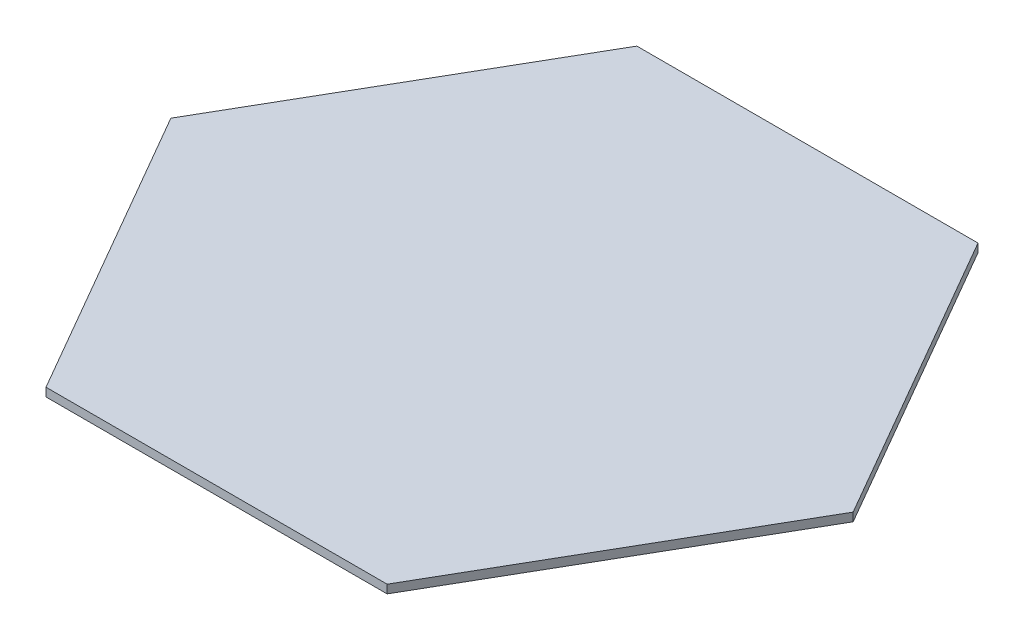
ISO-10303-21;
HEADER;
FILE_DESCRIPTION(('STEP AP214'),'2;1');
FILE_NAME('part.step','',(''),(''),'','','');
FILE_SCHEMA(('AUTOMOTIVE_DESIGN { 1 0 10303 214 1 1 1 1 }'));
ENDSEC;
DATA;
#1=APPLICATION_CONTEXT('core data for automotive mechanical design processes');
#2=APPLICATION_PROTOCOL_DEFINITION('international standard','automotive_design',2000,#1);
#3=PRODUCT_CONTEXT('',#1,'mechanical');
#4=PRODUCT('Part','Part','',(#3));
#5=PRODUCT_RELATED_PRODUCT_CATEGORY('part','',(#4));
#6=PRODUCT_DEFINITION_FORMATION('','',#4);
#7=PRODUCT_DEFINITION_CONTEXT('part definition',#1,'design');
#8=PRODUCT_DEFINITION('design','',#6,#7);
#9=PRODUCT_DEFINITION_SHAPE('','',#8);
#10=(LENGTH_UNIT() NAMED_UNIT(*) SI_UNIT(.MILLI.,.METRE.));
#11=(NAMED_UNIT(*) PLANE_ANGLE_UNIT() SI_UNIT($,.RADIAN.));
#12=(NAMED_UNIT(*) SI_UNIT($,.STERADIAN.) SOLID_ANGLE_UNIT());
#13=UNCERTAINTY_MEASURE_WITH_UNIT(LENGTH_MEASURE(1.E-05),#10,'distance_accuracy_value','');
#14=(GEOMETRIC_REPRESENTATION_CONTEXT(3) GLOBAL_UNCERTAINTY_ASSIGNED_CONTEXT((#13)) GLOBAL_UNIT_ASSIGNED_CONTEXT((#10,
#11,#12)) REPRESENTATION_CONTEXT('',''));
#15=CARTESIAN_POINT('',(0.,0.,0.));
#16=DIRECTION('',(0.,0.,1.));
#17=DIRECTION('',(1.,0.,0.));
#18=AXIS2_PLACEMENT_3D('',#15,#16,#17);
#19=CARTESIAN_POINT('',(80.8290376865489,4.,139.999999999998));
#20=DIRECTION('',(-0.866025403784442,0.,-0.499999999999995));
#21=DIRECTION('',(-0.499999999999995,0.,0.866025403784442));
#22=AXIS2_PLACEMENT_3D('',#19,#20,#21);
#23=PLANE('',#22);
#24=DIRECTION('',(0.499999999999995,0.,-0.866025403784442));
#25=VECTOR('',#24,1.);
#26=CARTESIAN_POINT('',(80.8290376865489,0.,139.999999999998));
#27=LINE('',#26,#25);
#28=CARTESIAN_POINT('',(80.8290376865489,0.,139.999999999998));
#29=VERTEX_POINT('',#28);
#30=CARTESIAN_POINT('',(161.658075373094,0.,0.));
#31=VERTEX_POINT('',#30);
#32=EDGE_CURVE('E132',#29,#31,#27,.T.);
#33=ORIENTED_EDGE('',*,*,#32,.T.);
#34=DIRECTION('',(0.,-1.,0.));
#35=VECTOR('',#34,1.);
#36=CARTESIAN_POINT('',(161.658075373094,4.,0.));
#37=LINE('',#36,#35);
#38=CARTESIAN_POINT('',(161.658075373094,4.,0.));
#39=VERTEX_POINT('',#38);
#40=EDGE_CURVE('E11',#39,#31,#37,.T.);
#41=ORIENTED_EDGE('',*,*,#40,.F.);
#42=DIRECTION('',(0.499999999999995,0.,-0.866025403784442));
#43=VECTOR('',#42,1.);
#44=CARTESIAN_POINT('',(80.8290376865489,4.,139.999999999998));
#45=LINE('',#44,#43);
#46=CARTESIAN_POINT('',(80.8290376865489,4.,139.999999999998));
#47=VERTEX_POINT('',#46);
#48=EDGE_CURVE('E148',#47,#39,#45,.T.);
#49=ORIENTED_EDGE('',*,*,#48,.F.);
#50=DIRECTION('',(0.,-1.,0.));
#51=VECTOR('',#50,1.);
#52=CARTESIAN_POINT('',(80.8290376865489,4.,139.999999999998));
#53=LINE('',#52,#51);
#54=EDGE_CURVE('E128',#47,#29,#53,.T.);
#55=ORIENTED_EDGE('',*,*,#54,.T.);
#56=EDGE_LOOP('',(#33,#41,#49,#55));
#57=FACE_BOUND('',#56,.T.);
#58=ADVANCED_FACE('F43',(#57),#23,.F.);
#59=CARTESIAN_POINT('',(161.658075373094,4.,0.));
#60=DIRECTION('',(-0.866025403784438,0.,0.500000000000001));
#61=DIRECTION('',(0.500000000000001,0.,0.866025403784438));
#62=AXIS2_PLACEMENT_3D('',#59,#60,#61);
#63=PLANE('',#62);
#64=DIRECTION('',(-0.500000000000001,0.,-0.866025403784438));
#65=VECTOR('',#64,1.);
#66=CARTESIAN_POINT('',(161.658075373094,0.,0.));
#67=LINE('',#66,#65);
#68=CARTESIAN_POINT('',(80.8290376865469,0.,-140.));
#69=VERTEX_POINT('',#68);
#70=EDGE_CURVE('E136',#31,#69,#67,.T.);
#71=ORIENTED_EDGE('',*,*,#70,.T.);
#72=DIRECTION('',(0.,-1.,0.));
#73=VECTOR('',#72,1.);
#74=CARTESIAN_POINT('',(80.8290376865469,4.,-140.));
#75=LINE('',#74,#73);
#76=CARTESIAN_POINT('',(80.8290376865469,4.,-140.));
#77=VERTEX_POINT('',#76);
#78=EDGE_CURVE('E52',#77,#69,#75,.T.);
#79=ORIENTED_EDGE('',*,*,#78,.F.);
#80=DIRECTION('',(-0.500000000000001,0.,-0.866025403784438));
#81=VECTOR('',#80,1.);
#82=CARTESIAN_POINT('',(161.658075373094,4.,0.));
#83=LINE('',#82,#81);
#84=EDGE_CURVE('E97',#39,#77,#83,.T.);
#85=ORIENTED_EDGE('',*,*,#84,.F.);
#86=ORIENTED_EDGE('',*,*,#40,.T.);
#87=EDGE_LOOP('',(#71,#79,#85,#86));
#88=FACE_BOUND('',#87,.T.);
#89=ADVANCED_FACE('F176',(#88),#63,.F.);
#90=CARTESIAN_POINT('',(80.8290376865469,4.,-140.));
#91=DIRECTION('',(0.,0.,1.));
#92=DIRECTION('',(1.,0.,0.));
#93=AXIS2_PLACEMENT_3D('',#90,#91,#92);
#94=PLANE('',#93);
#95=DIRECTION('',(-1.,0.,0.));
#96=VECTOR('',#95,1.);
#97=CARTESIAN_POINT('',(80.8290376865469,0.,-140.));
#98=LINE('',#97,#96);
#99=CARTESIAN_POINT('',(-80.8290376865478,0.,-139.999999999999));
#100=VERTEX_POINT('',#99);
#101=EDGE_CURVE('E139',#69,#100,#98,.T.);
#102=ORIENTED_EDGE('',*,*,#101,.T.);
#103=DIRECTION('',(0.,-1.,0.));
#104=VECTOR('',#103,1.);
#105=CARTESIAN_POINT('',(-80.8290376865478,4.,-139.999999999999));
#106=LINE('',#105,#104);
#107=CARTESIAN_POINT('',(-80.8290376865478,4.,-139.999999999999));
#108=VERTEX_POINT('',#107);
#109=EDGE_CURVE('E121',#108,#100,#106,.T.);
#110=ORIENTED_EDGE('',*,*,#109,.F.);
#111=DIRECTION('',(-1.,0.,0.));
#112=VECTOR('',#111,1.);
#113=CARTESIAN_POINT('',(80.8290376865469,4.,-140.));
#114=LINE('',#113,#112);
#115=EDGE_CURVE('E110',#77,#108,#114,.T.);
#116=ORIENTED_EDGE('',*,*,#115,.F.);
#117=ORIENTED_EDGE('',*,*,#78,.T.);
#118=EDGE_LOOP('',(#102,#110,#116,#117));
#119=FACE_BOUND('',#118,.T.);
#120=ADVANCED_FACE('F158',(#119),#94,.F.);
#121=CARTESIAN_POINT('',(-80.8290376865478,4.,-139.999999999999));
#122=DIRECTION('',(0.866025403784442,0.,0.499999999999995));
#123=DIRECTION('',(0.499999999999995,0.,-0.866025403784442));
#124=AXIS2_PLACEMENT_3D('',#121,#122,#123);
#125=PLANE('',#124);
#126=DIRECTION('',(-0.499999999999995,0.,0.866025403784442));
#127=VECTOR('',#126,1.);
#128=CARTESIAN_POINT('',(-80.8290376865478,0.,-139.999999999999));
#129=LINE('',#128,#127);
#130=CARTESIAN_POINT('',(-161.658075373094,0.,1.12885230687691E-12));
#131=VERTEX_POINT('',#130);
#132=EDGE_CURVE('E119',#100,#131,#129,.T.);
#133=ORIENTED_EDGE('',*,*,#132,.T.);
#134=DIRECTION('',(0.,-1.,0.));
#135=VECTOR('',#134,1.);
#136=CARTESIAN_POINT('',(-161.658075373094,4.,1.12885230687691E-12));
#137=LINE('',#136,#135);
#138=CARTESIAN_POINT('',(-161.658075373094,4.,1.12885230687691E-12));
#139=VERTEX_POINT('',#138);
#140=EDGE_CURVE('E116',#139,#131,#137,.T.);
#141=ORIENTED_EDGE('',*,*,#140,.F.);
#142=DIRECTION('',(-0.499999999999995,0.,0.866025403784442));
#143=VECTOR('',#142,1.);
#144=CARTESIAN_POINT('',(-80.8290376865478,4.,-139.999999999999));
#145=LINE('',#144,#143);
#146=EDGE_CURVE('E104',#108,#139,#145,.T.);
#147=ORIENTED_EDGE('',*,*,#146,.F.);
#148=ORIENTED_EDGE('',*,*,#109,.T.);
#149=EDGE_LOOP('',(#133,#141,#147,#148));
#150=FACE_BOUND('',#149,.T.);
#151=ADVANCED_FACE('F117',(#150),#125,.F.);
#152=CARTESIAN_POINT('',(-161.658075373094,4.,1.12885230687691E-12));
#153=DIRECTION('',(0.866025403784435,0.,-0.500000000000007));
#154=DIRECTION('',(-0.500000000000007,0.,-0.866025403784435));
#155=AXIS2_PLACEMENT_3D('',#152,#153,#154);
#156=PLANE('',#155);
#157=DIRECTION('',(0.500000000000007,0.,0.866025403784435));
#158=VECTOR('',#157,1.);
#159=CARTESIAN_POINT('',(-161.658075373094,0.,1.12885230687691E-12));
#160=LINE('',#159,#158);
#161=CARTESIAN_POINT('',(-80.8290376865459,0.,140.));
#162=VERTEX_POINT('',#161);
#163=EDGE_CURVE('E83',#131,#162,#160,.T.);
#164=ORIENTED_EDGE('',*,*,#163,.T.);
#165=DIRECTION('',(0.,-1.,0.));
#166=VECTOR('',#165,1.);
#167=CARTESIAN_POINT('',(-80.8290376865459,4.,140.));
#168=LINE('',#167,#166);
#169=CARTESIAN_POINT('',(-80.8290376865459,4.,140.));
#170=VERTEX_POINT('',#169);
#171=EDGE_CURVE('E122',#170,#162,#168,.T.);
#172=ORIENTED_EDGE('',*,*,#171,.F.);
#173=DIRECTION('',(0.500000000000007,0.,0.866025403784435));
#174=VECTOR('',#173,1.);
#175=CARTESIAN_POINT('',(-161.658075373094,4.,1.12885230687691E-12));
#176=LINE('',#175,#174);
#177=EDGE_CURVE('E108',#139,#170,#176,.T.);
#178=ORIENTED_EDGE('',*,*,#177,.F.);
#179=ORIENTED_EDGE('',*,*,#140,.T.);
#180=EDGE_LOOP('',(#164,#172,#178,#179));
#181=FACE_BOUND('',#180,.T.);
#182=ADVANCED_FACE('F124',(#181),#156,.F.);
#183=CARTESIAN_POINT('',(-80.8290376865459,4.,140.));
#184=DIRECTION('',(0.,0.,-1.));
#185=DIRECTION('',(-1.,0.,0.));
#186=AXIS2_PLACEMENT_3D('',#183,#184,#185);
#187=PLANE('',#186);
#188=DIRECTION('',(1.,0.,0.));
#189=VECTOR('',#188,1.);
#190=CARTESIAN_POINT('',(-80.8290376865459,0.,140.));
#191=LINE('',#190,#189);
#192=EDGE_CURVE('E89',#162,#29,#191,.T.);
#193=ORIENTED_EDGE('',*,*,#192,.T.);
#194=ORIENTED_EDGE('',*,*,#54,.F.);
#195=DIRECTION('',(1.,0.,0.));
#196=VECTOR('',#195,1.);
#197=CARTESIAN_POINT('',(-80.8290376865459,4.,140.));
#198=LINE('',#197,#196);
#199=EDGE_CURVE('E60',#170,#47,#198,.T.);
#200=ORIENTED_EDGE('',*,*,#199,.F.);
#201=ORIENTED_EDGE('',*,*,#171,.T.);
#202=EDGE_LOOP('',(#193,#194,#200,#201));
#203=FACE_BOUND('',#202,.T.);
#204=ADVANCED_FACE('F165',(#203),#187,.F.);
#205=CARTESIAN_POINT('',(0.,4.,0.));
#206=DIRECTION('',(0.,1.,0.));
#207=DIRECTION('',(0.,0.,1.));
#208=AXIS2_PLACEMENT_3D('',#205,#206,#207);
#209=PLANE('',#208);
#210=ORIENTED_EDGE('',*,*,#48,.T.);
#211=ORIENTED_EDGE('',*,*,#84,.T.);
#212=ORIENTED_EDGE('',*,*,#115,.T.);
#213=ORIENTED_EDGE('',*,*,#146,.T.);
#214=ORIENTED_EDGE('',*,*,#177,.T.);
#215=ORIENTED_EDGE('',*,*,#199,.T.);
#216=EDGE_LOOP('',(#210,#211,#212,#213,#214,#215));
#217=FACE_BOUND('',#216,.T.);
#218=ADVANCED_FACE('F106',(#217),#209,.T.);
#219=CARTESIAN_POINT('',(0.,0.,0.));
#220=DIRECTION('',(0.,1.,0.));
#221=DIRECTION('',(0.,0.,1.));
#222=AXIS2_PLACEMENT_3D('',#219,#220,#221);
#223=PLANE('',#222);
#224=ORIENTED_EDGE('',*,*,#32,.F.);
#225=ORIENTED_EDGE('',*,*,#192,.F.);
#226=ORIENTED_EDGE('',*,*,#163,.F.);
#227=ORIENTED_EDGE('',*,*,#132,.F.);
#228=ORIENTED_EDGE('',*,*,#101,.F.);
#229=ORIENTED_EDGE('',*,*,#70,.F.);
#230=EDGE_LOOP('',(#224,#225,#226,#227,#228,#229));
#231=FACE_BOUND('',#230,.T.);
#232=ADVANCED_FACE('F161',(#231),#223,.F.);
#233=CLOSED_SHELL('',(#58,#89,#120,#151,#182,#204,#218,#232));
#234=MANIFOLD_SOLID_BREP('B2',#233);
#235=ADVANCED_BREP_SHAPE_REPRESENTATION('',(#18,#234),#14);
#236=SHAPE_DEFINITION_REPRESENTATION(#9,#235);
ENDSEC;
END-ISO-10303-21;
